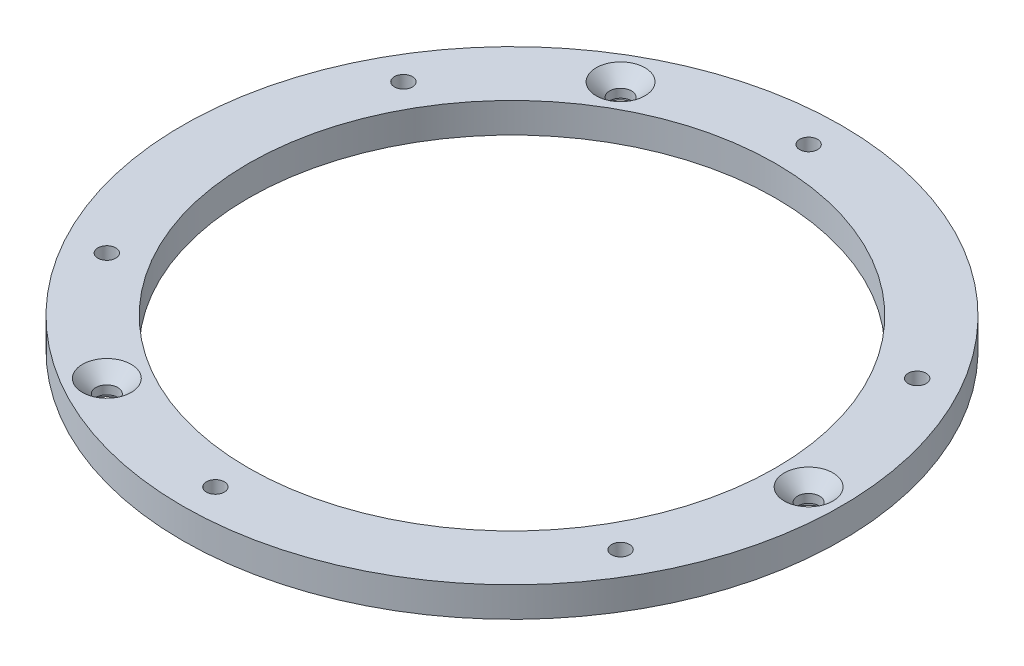
ISO-10303-21;
HEADER;
FILE_DESCRIPTION(('STEP AP214'),'2;1');
FILE_NAME('part.step','',(''),(''),'','','');
FILE_SCHEMA(('AUTOMOTIVE_DESIGN { 1 0 10303 214 1 1 1 1 }'));
ENDSEC;
DATA;
#1=APPLICATION_CONTEXT('core data for automotive mechanical design processes');
#2=APPLICATION_PROTOCOL_DEFINITION('international standard','automotive_design',2000,#1);
#3=PRODUCT_CONTEXT('',#1,'mechanical');
#4=PRODUCT('Part','Part','',(#3));
#5=PRODUCT_RELATED_PRODUCT_CATEGORY('part','',(#4));
#6=PRODUCT_DEFINITION_FORMATION('','',#4);
#7=PRODUCT_DEFINITION_CONTEXT('part definition',#1,'design');
#8=PRODUCT_DEFINITION('design','',#6,#7);
#9=PRODUCT_DEFINITION_SHAPE('','',#8);
#10=(LENGTH_UNIT() NAMED_UNIT(*) SI_UNIT(.MILLI.,.METRE.));
#11=(NAMED_UNIT(*) PLANE_ANGLE_UNIT() SI_UNIT($,.RADIAN.));
#12=(NAMED_UNIT(*) SI_UNIT($,.STERADIAN.) SOLID_ANGLE_UNIT());
#13=UNCERTAINTY_MEASURE_WITH_UNIT(LENGTH_MEASURE(1.E-05),#10,'distance_accuracy_value','');
#14=(GEOMETRIC_REPRESENTATION_CONTEXT(3) GLOBAL_UNCERTAINTY_ASSIGNED_CONTEXT((#13)) GLOBAL_UNIT_ASSIGNED_CONTEXT((#10,
#11,#12)) REPRESENTATION_CONTEXT('',''));
#15=CARTESIAN_POINT('',(0.,0.,0.));
#16=DIRECTION('',(0.,0.,1.));
#17=DIRECTION('',(1.,0.,0.));
#18=AXIS2_PLACEMENT_3D('',#15,#16,#17);
#19=CARTESIAN_POINT('',(0.,15.,0.));
#20=DIRECTION('',(0.,1.,0.));
#21=DIRECTION('',(0.,0.,1.));
#22=AXIS2_PLACEMENT_3D('',#19,#20,#21);
#23=PLANE('',#22);
#24=CARTESIAN_POINT('',(-74.2500000000016,15.,-128.604772461988));
#25=DIRECTION('',(0.,1.,0.));
#26=DIRECTION('',(0.,0.,1.));
#27=AXIS2_PLACEMENT_3D('',#24,#25,#26);
#28=CIRCLE('',#27,12.2);
#29=CARTESIAN_POINT('',(-74.2500000000016,15.,-116.404772461988));
#30=VERTEX_POINT('',#29);
#31=EDGE_CURVE('E162',#30,#30,#28,.T.);
#32=ORIENTED_EDGE('',*,*,#31,.F.);
#33=EDGE_LOOP('',(#32));
#34=FACE_BOUND('',#33,.T.);
#35=CARTESIAN_POINT('',(148.5,15.,-1.11022302462516E-12));
#36=DIRECTION('',(0.,1.,0.));
#37=DIRECTION('',(0.,0.,1.));
#38=AXIS2_PLACEMENT_3D('',#35,#36,#37);
#39=CIRCLE('',#38,12.2);
#40=CARTESIAN_POINT('',(148.5,15.,12.1999999999989));
#41=VERTEX_POINT('',#40);
#42=EDGE_CURVE('E71',#41,#41,#39,.T.);
#43=ORIENTED_EDGE('',*,*,#42,.F.);
#44=EDGE_LOOP('',(#43));
#45=FACE_BOUND('',#44,.T.);
#46=CARTESIAN_POINT('',(-74.2499999999998,15.,128.60477246199));
#47=DIRECTION('',(0.,1.,0.));
#48=DIRECTION('',(0.,0.,1.));
#49=AXIS2_PLACEMENT_3D('',#46,#47,#48);
#50=CIRCLE('',#49,12.2);
#51=CARTESIAN_POINT('',(-74.2499999999998,15.,140.80477246199));
#52=VERTEX_POINT('',#51);
#53=EDGE_CURVE('E82',#52,#52,#50,.T.);
#54=ORIENTED_EDGE('',*,*,#53,.F.);
#55=EDGE_LOOP('',(#54));
#56=FACE_BOUND('',#55,.T.);
#57=CARTESIAN_POINT('',(128.604772461988,15.,-74.2500000000016));
#58=DIRECTION('',(0.,-1.,0.));
#59=DIRECTION('',(0.,0.,-1.));
#60=AXIS2_PLACEMENT_3D('',#57,#58,#59);
#61=CIRCLE('',#60,4.5);
#62=CARTESIAN_POINT('',(128.604772461988,15.,-78.7500000000016));
#63=VERTEX_POINT('',#62);
#64=EDGE_CURVE('E100',#63,#63,#61,.T.);
#65=ORIENTED_EDGE('',*,*,#64,.T.);
#66=EDGE_LOOP('',(#65));
#67=FACE_BOUND('',#66,.T.);
#68=CARTESIAN_POINT('',(128.60477246199,15.,74.2499999999989));
#69=DIRECTION('',(0.,-1.,0.));
#70=DIRECTION('',(0.,0.,-1.));
#71=AXIS2_PLACEMENT_3D('',#68,#69,#70);
#72=CIRCLE('',#71,4.5);
#73=CARTESIAN_POINT('',(128.60477246199,15.,69.7499999999989));
#74=VERTEX_POINT('',#73);
#75=EDGE_CURVE('E106',#74,#74,#72,.T.);
#76=ORIENTED_EDGE('',*,*,#75,.T.);
#77=EDGE_LOOP('',(#76));
#78=FACE_BOUND('',#77,.T.);
#79=CARTESIAN_POINT('',(0.,15.,148.5));
#80=DIRECTION('',(0.,-1.,0.));
#81=DIRECTION('',(0.,0.,-1.));
#82=AXIS2_PLACEMENT_3D('',#79,#80,#81);
#83=CIRCLE('',#82,4.5);
#84=CARTESIAN_POINT('',(0.,15.,144.));
#85=VERTEX_POINT('',#84);
#86=EDGE_CURVE('E112',#85,#85,#83,.T.);
#87=ORIENTED_EDGE('',*,*,#86,.T.);
#88=EDGE_LOOP('',(#87));
#89=FACE_BOUND('',#88,.T.);
#90=CARTESIAN_POINT('',(-128.604772461989,15.,74.2500000000007));
#91=DIRECTION('',(0.,-1.,0.));
#92=DIRECTION('',(0.,0.,-1.));
#93=AXIS2_PLACEMENT_3D('',#90,#91,#92);
#94=CIRCLE('',#93,4.5);
#95=CARTESIAN_POINT('',(-128.604772461989,15.,69.7500000000007));
#96=VERTEX_POINT('',#95);
#97=EDGE_CURVE('E118',#96,#96,#94,.T.);
#98=ORIENTED_EDGE('',*,*,#97,.T.);
#99=EDGE_LOOP('',(#98));
#100=FACE_BOUND('',#99,.T.);
#101=CARTESIAN_POINT('',(-128.60477246199,15.,-74.2499999999998));
#102=DIRECTION('',(0.,-1.,0.));
#103=DIRECTION('',(0.,0.,-1.));
#104=AXIS2_PLACEMENT_3D('',#101,#102,#103);
#105=CIRCLE('',#104,4.5);
#106=CARTESIAN_POINT('',(-128.60477246199,15.,-78.7499999999998));
#107=VERTEX_POINT('',#106);
#108=EDGE_CURVE('E124',#107,#107,#105,.T.);
#109=ORIENTED_EDGE('',*,*,#108,.T.);
#110=EDGE_LOOP('',(#109));
#111=FACE_BOUND('',#110,.T.);
#112=CARTESIAN_POINT('',(0.,15.,-148.5));
#113=DIRECTION('',(0.,-1.,0.));
#114=DIRECTION('',(0.,0.,-1.));
#115=AXIS2_PLACEMENT_3D('',#112,#113,#114);
#116=CIRCLE('',#115,4.5);
#117=CARTESIAN_POINT('',(0.,15.,-153.));
#118=VERTEX_POINT('',#117);
#119=EDGE_CURVE('E130',#118,#118,#116,.T.);
#120=ORIENTED_EDGE('',*,*,#119,.T.);
#121=EDGE_LOOP('',(#120));
#122=FACE_BOUND('',#121,.T.);
#123=CARTESIAN_POINT('',(0.,15.,0.));
#124=DIRECTION('',(0.,1.,0.));
#125=DIRECTION('',(0.,0.,1.));
#126=AXIS2_PLACEMENT_3D('',#123,#124,#125);
#127=CIRCLE('',#126,165.);
#128=CARTESIAN_POINT('',(0.,15.,165.));
#129=VERTEX_POINT('',#128);
#130=EDGE_CURVE('E10',#129,#129,#127,.T.);
#131=ORIENTED_EDGE('',*,*,#130,.T.);
#132=EDGE_LOOP('',(#131));
#133=FACE_BOUND('',#132,.T.);
#134=CARTESIAN_POINT('',(0.,15.,0.));
#135=DIRECTION('',(0.,1.,0.));
#136=DIRECTION('',(0.,0.,1.));
#137=AXIS2_PLACEMENT_3D('',#134,#135,#136);
#138=CIRCLE('',#137,132.);
#139=CARTESIAN_POINT('',(0.,15.,132.));
#140=VERTEX_POINT('',#139);
#141=EDGE_CURVE('E51',#140,#140,#138,.T.);
#142=ORIENTED_EDGE('',*,*,#141,.F.);
#143=EDGE_LOOP('',(#142));
#144=FACE_BOUND('',#143,.T.);
#145=ADVANCED_FACE('F38',(#34,#45,#56,#67,#78,#89,#100,#111,#122,#133,#144),#23,.T.);
#146=CARTESIAN_POINT('',(0.,0.,0.));
#147=DIRECTION('',(0.,1.,0.));
#148=DIRECTION('',(0.,0.,1.));
#149=AXIS2_PLACEMENT_3D('',#146,#147,#148);
#150=PLANE('',#149);
#151=CARTESIAN_POINT('',(148.5,0.,-1.11022302462516E-12));
#152=DIRECTION('',(0.,-1.,0.));
#153=DIRECTION('',(-0.866025403784438,0.,0.500000000000005));
#154=AXIS2_PLACEMENT_3D('',#151,#152,#153);
#155=CIRCLE('',#154,9.99999999999998);
#156=CARTESIAN_POINT('',(139.839745962156,0.,4.99999999999893));
#157=VERTEX_POINT('',#156);
#158=EDGE_CURVE('E83',#157,#157,#155,.T.);
#159=ORIENTED_EDGE('',*,*,#158,.F.);
#160=EDGE_LOOP('',(#159));
#161=FACE_BOUND('',#160,.T.);
#162=CARTESIAN_POINT('',(-74.2500000000016,0.,-128.604772461988));
#163=DIRECTION('',(0.,-1.,0.));
#164=DIRECTION('',(0.866025403784445,0.,0.499999999999993));
#165=AXIS2_PLACEMENT_3D('',#162,#163,#164);
#166=CIRCLE('',#165,9.99999999999998);
#167=CARTESIAN_POINT('',(-65.5897459621572,0.,-123.604772461988));
#168=VERTEX_POINT('',#167);
#169=EDGE_CURVE('E63',#168,#168,#166,.T.);
#170=ORIENTED_EDGE('',*,*,#169,.F.);
#171=EDGE_LOOP('',(#170));
#172=FACE_BOUND('',#171,.T.);
#173=CARTESIAN_POINT('',(-74.2499999999998,0.,128.60477246199));
#174=DIRECTION('',(0.,-1.,0.));
#175=DIRECTION('',(0.,0.,-1.));
#176=AXIS2_PLACEMENT_3D('',#173,#174,#175);
#177=CIRCLE('',#176,9.99999999999998);
#178=CARTESIAN_POINT('',(-74.2499999999998,0.,118.60477246199));
#179=VERTEX_POINT('',#178);
#180=EDGE_CURVE('E59',#179,#179,#177,.T.);
#181=ORIENTED_EDGE('',*,*,#180,.F.);
#182=EDGE_LOOP('',(#181));
#183=FACE_BOUND('',#182,.T.);
#184=CARTESIAN_POINT('',(128.604772461988,0.,-74.2500000000016));
#185=DIRECTION('',(0.,-1.,0.));
#186=DIRECTION('',(0.,0.,-1.));
#187=AXIS2_PLACEMENT_3D('',#184,#185,#186);
#188=CIRCLE('',#187,4.5);
#189=CARTESIAN_POINT('',(128.604772461988,0.,-78.7500000000016));
#190=VERTEX_POINT('',#189);
#191=EDGE_CURVE('E95',#190,#190,#188,.T.);
#192=ORIENTED_EDGE('',*,*,#191,.F.);
#193=EDGE_LOOP('',(#192));
#194=FACE_BOUND('',#193,.T.);
#195=CARTESIAN_POINT('',(128.60477246199,0.,74.2499999999989));
#196=DIRECTION('',(0.,-1.,0.));
#197=DIRECTION('',(0.,0.,-1.));
#198=AXIS2_PLACEMENT_3D('',#195,#196,#197);
#199=CIRCLE('',#198,4.5);
#200=CARTESIAN_POINT('',(128.60477246199,0.,69.7499999999989));
#201=VERTEX_POINT('',#200);
#202=EDGE_CURVE('E103',#201,#201,#199,.T.);
#203=ORIENTED_EDGE('',*,*,#202,.F.);
#204=EDGE_LOOP('',(#203));
#205=FACE_BOUND('',#204,.T.);
#206=CARTESIAN_POINT('',(0.,0.,148.5));
#207=DIRECTION('',(0.,-1.,0.));
#208=DIRECTION('',(0.,0.,-1.));
#209=AXIS2_PLACEMENT_3D('',#206,#207,#208);
#210=CIRCLE('',#209,4.5);
#211=CARTESIAN_POINT('',(0.,0.,144.));
#212=VERTEX_POINT('',#211);
#213=EDGE_CURVE('E109',#212,#212,#210,.T.);
#214=ORIENTED_EDGE('',*,*,#213,.F.);
#215=EDGE_LOOP('',(#214));
#216=FACE_BOUND('',#215,.T.);
#217=CARTESIAN_POINT('',(-128.604772461989,0.,74.2500000000007));
#218=DIRECTION('',(0.,-1.,0.));
#219=DIRECTION('',(0.,0.,-1.));
#220=AXIS2_PLACEMENT_3D('',#217,#218,#219);
#221=CIRCLE('',#220,4.5);
#222=CARTESIAN_POINT('',(-128.604772461989,0.,69.7500000000007));
#223=VERTEX_POINT('',#222);
#224=EDGE_CURVE('E115',#223,#223,#221,.T.);
#225=ORIENTED_EDGE('',*,*,#224,.F.);
#226=EDGE_LOOP('',(#225));
#227=FACE_BOUND('',#226,.T.);
#228=CARTESIAN_POINT('',(-128.60477246199,0.,-74.2499999999998));
#229=DIRECTION('',(0.,-1.,0.));
#230=DIRECTION('',(0.,0.,-1.));
#231=AXIS2_PLACEMENT_3D('',#228,#229,#230);
#232=CIRCLE('',#231,4.5);
#233=CARTESIAN_POINT('',(-128.60477246199,0.,-78.7499999999998));
#234=VERTEX_POINT('',#233);
#235=EDGE_CURVE('E121',#234,#234,#232,.T.);
#236=ORIENTED_EDGE('',*,*,#235,.F.);
#237=EDGE_LOOP('',(#236));
#238=FACE_BOUND('',#237,.T.);
#239=CARTESIAN_POINT('',(0.,0.,-148.5));
#240=DIRECTION('',(0.,-1.,0.));
#241=DIRECTION('',(0.,0.,-1.));
#242=AXIS2_PLACEMENT_3D('',#239,#240,#241);
#243=CIRCLE('',#242,4.5);
#244=CARTESIAN_POINT('',(0.,0.,-153.));
#245=VERTEX_POINT('',#244);
#246=EDGE_CURVE('E127',#245,#245,#243,.T.);
#247=ORIENTED_EDGE('',*,*,#246,.F.);
#248=EDGE_LOOP('',(#247));
#249=FACE_BOUND('',#248,.T.);
#250=CARTESIAN_POINT('',(0.,0.,0.));
#251=DIRECTION('',(0.,1.,0.));
#252=DIRECTION('',(0.,0.,1.));
#253=AXIS2_PLACEMENT_3D('',#250,#251,#252);
#254=CIRCLE('',#253,165.);
#255=CARTESIAN_POINT('',(0.,0.,165.));
#256=VERTEX_POINT('',#255);
#257=EDGE_CURVE('E46',#256,#256,#254,.T.);
#258=ORIENTED_EDGE('',*,*,#257,.F.);
#259=EDGE_LOOP('',(#258));
#260=FACE_BOUND('',#259,.T.);
#261=CARTESIAN_POINT('',(0.,0.,0.));
#262=DIRECTION('',(0.,1.,0.));
#263=DIRECTION('',(0.,0.,1.));
#264=AXIS2_PLACEMENT_3D('',#261,#262,#263);
#265=CIRCLE('',#264,132.);
#266=CARTESIAN_POINT('',(0.,0.,132.));
#267=VERTEX_POINT('',#266);
#268=EDGE_CURVE('E54',#267,#267,#265,.T.);
#269=ORIENTED_EDGE('',*,*,#268,.T.);
#270=EDGE_LOOP('',(#269));
#271=FACE_BOUND('',#270,.T.);
#272=ADVANCED_FACE('F138',(#161,#172,#183,#194,#205,#216,#227,#238,#249,#260,#271),#150,.F.);
#273=CARTESIAN_POINT('',(0.,15.,0.));
#274=DIRECTION('',(0.,-1.,0.));
#275=DIRECTION('',(0.,0.,-1.));
#276=AXIS2_PLACEMENT_3D('',#273,#274,#275);
#277=CYLINDRICAL_SURFACE('',#276,165.);
#278=ORIENTED_EDGE('',*,*,#130,.F.);
#279=EDGE_LOOP('',(#278));
#280=FACE_BOUND('',#279,.T.);
#281=ORIENTED_EDGE('',*,*,#257,.T.);
#282=EDGE_LOOP('',(#281));
#283=FACE_BOUND('',#282,.T.);
#284=ADVANCED_FACE('F40',(#280,#283),#277,.T.);
#285=CARTESIAN_POINT('',(0.,15.,0.));
#286=DIRECTION('',(0.,-1.,0.));
#287=DIRECTION('',(0.,0.,-1.));
#288=AXIS2_PLACEMENT_3D('',#285,#286,#287);
#289=CYLINDRICAL_SURFACE('',#288,132.);
#290=ORIENTED_EDGE('',*,*,#141,.T.);
#291=EDGE_LOOP('',(#290));
#292=FACE_BOUND('',#291,.T.);
#293=ORIENTED_EDGE('',*,*,#268,.F.);
#294=EDGE_LOOP('',(#293));
#295=FACE_BOUND('',#294,.T.);
#296=ADVANCED_FACE('F140',(#292,#295),#289,.F.);
#297=CARTESIAN_POINT('',(0.,0.,-148.5));
#298=DIRECTION('',(0.,-1.,0.));
#299=DIRECTION('',(0.,0.,-1.));
#300=AXIS2_PLACEMENT_3D('',#297,#298,#299);
#301=CYLINDRICAL_SURFACE('',#300,4.5);
#302=ORIENTED_EDGE('',*,*,#119,.F.);
#303=EDGE_LOOP('',(#302));
#304=FACE_BOUND('',#303,.T.);
#305=ORIENTED_EDGE('',*,*,#246,.T.);
#306=EDGE_LOOP('',(#305));
#307=FACE_BOUND('',#306,.T.);
#308=ADVANCED_FACE('F142',(#304,#307),#301,.F.);
#309=CARTESIAN_POINT('',(-128.60477246199,0.,-74.2499999999998));
#310=DIRECTION('',(0.,-1.,0.));
#311=DIRECTION('',(0.,0.,-1.));
#312=AXIS2_PLACEMENT_3D('',#309,#310,#311);
#313=CYLINDRICAL_SURFACE('',#312,4.5);
#314=ORIENTED_EDGE('',*,*,#108,.F.);
#315=EDGE_LOOP('',(#314));
#316=FACE_BOUND('',#315,.T.);
#317=ORIENTED_EDGE('',*,*,#235,.T.);
#318=EDGE_LOOP('',(#317));
#319=FACE_BOUND('',#318,.T.);
#320=ADVANCED_FACE('F148',(#316,#319),#313,.F.);
#321=CARTESIAN_POINT('',(-128.604772461989,0.,74.2500000000007));
#322=DIRECTION('',(0.,-1.,0.));
#323=DIRECTION('',(0.,0.,-1.));
#324=AXIS2_PLACEMENT_3D('',#321,#322,#323);
#325=CYLINDRICAL_SURFACE('',#324,4.5);
#326=ORIENTED_EDGE('',*,*,#97,.F.);
#327=EDGE_LOOP('',(#326));
#328=FACE_BOUND('',#327,.T.);
#329=ORIENTED_EDGE('',*,*,#224,.T.);
#330=EDGE_LOOP('',(#329));
#331=FACE_BOUND('',#330,.T.);
#332=ADVANCED_FACE('F188',(#328,#331),#325,.F.);
#333=CARTESIAN_POINT('',(0.,0.,148.5));
#334=DIRECTION('',(0.,-1.,0.));
#335=DIRECTION('',(0.,0.,-1.));
#336=AXIS2_PLACEMENT_3D('',#333,#334,#335);
#337=CYLINDRICAL_SURFACE('',#336,4.5);
#338=ORIENTED_EDGE('',*,*,#86,.F.);
#339=EDGE_LOOP('',(#338));
#340=FACE_BOUND('',#339,.T.);
#341=ORIENTED_EDGE('',*,*,#213,.T.);
#342=EDGE_LOOP('',(#341));
#343=FACE_BOUND('',#342,.T.);
#344=ADVANCED_FACE('F195',(#340,#343),#337,.F.);
#345=CARTESIAN_POINT('',(128.60477246199,0.,74.2499999999989));
#346=DIRECTION('',(0.,-1.,0.));
#347=DIRECTION('',(0.,0.,-1.));
#348=AXIS2_PLACEMENT_3D('',#345,#346,#347);
#349=CYLINDRICAL_SURFACE('',#348,4.5);
#350=ORIENTED_EDGE('',*,*,#75,.F.);
#351=EDGE_LOOP('',(#350));
#352=FACE_BOUND('',#351,.T.);
#353=ORIENTED_EDGE('',*,*,#202,.T.);
#354=EDGE_LOOP('',(#353));
#355=FACE_BOUND('',#354,.T.);
#356=ADVANCED_FACE('F201',(#352,#355),#349,.F.);
#357=CARTESIAN_POINT('',(128.604772461988,0.,-74.2500000000016));
#358=DIRECTION('',(0.,-1.,0.));
#359=DIRECTION('',(0.,0.,-1.));
#360=AXIS2_PLACEMENT_3D('',#357,#358,#359);
#361=CYLINDRICAL_SURFACE('',#360,4.5);
#362=ORIENTED_EDGE('',*,*,#64,.F.);
#363=EDGE_LOOP('',(#362));
#364=FACE_BOUND('',#363,.T.);
#365=ORIENTED_EDGE('',*,*,#191,.T.);
#366=EDGE_LOOP('',(#365));
#367=FACE_BOUND('',#366,.T.);
#368=ADVANCED_FACE('F205',(#364,#367),#361,.F.);
#369=CARTESIAN_POINT('',(-74.2499999999998,4.,128.60477246199));
#370=DIRECTION('',(0.,-1.,0.));
#371=DIRECTION('',(0.,0.,-1.));
#372=AXIS2_PLACEMENT_3D('',#369,#370,#371);
#373=CYLINDRICAL_SURFACE('',#372,9.99999999999998);
#374=CARTESIAN_POINT('',(-74.2499999999998,4.,128.60477246199));
#375=DIRECTION('',(0.,-1.,0.));
#376=DIRECTION('',(0.,0.,-1.));
#377=AXIS2_PLACEMENT_3D('',#374,#375,#376);
#378=CIRCLE('',#377,9.99999999999998);
#379=CARTESIAN_POINT('',(-74.2499999999998,4.,118.60477246199));
#380=VERTEX_POINT('',#379);
#381=EDGE_CURVE('E92',#380,#380,#378,.T.);
#382=ORIENTED_EDGE('',*,*,#381,.F.);
#383=EDGE_LOOP('',(#382));
#384=FACE_BOUND('',#383,.T.);
#385=ORIENTED_EDGE('',*,*,#180,.T.);
#386=EDGE_LOOP('',(#385));
#387=FACE_BOUND('',#386,.T.);
#388=ADVANCED_FACE('F209',(#384,#387),#373,.F.);
#389=CARTESIAN_POINT('',(-74.2499999999998,4.,128.60477246199));
#390=DIRECTION('',(0.,-1.,0.));
#391=DIRECTION('',(0.,0.,-1.));
#392=AXIS2_PLACEMENT_3D('',#389,#390,#391);
#393=PLANE('',#392);
#394=CARTESIAN_POINT('',(-74.2499999999998,4.,128.60477246199));
#395=DIRECTION('',(0.,-1.,0.));
#396=DIRECTION('',(0.,0.,-1.));
#397=AXIS2_PLACEMENT_3D('',#394,#395,#396);
#398=CIRCLE('',#397,5.49999999999999);
#399=CARTESIAN_POINT('',(-74.2499999999998,4.,123.10477246199));
#400=VERTEX_POINT('',#399);
#401=EDGE_CURVE('E57',#400,#400,#398,.T.);
#402=ORIENTED_EDGE('',*,*,#401,.F.);
#403=EDGE_LOOP('',(#402));
#404=FACE_BOUND('',#403,.T.);
#405=ORIENTED_EDGE('',*,*,#381,.T.);
#406=EDGE_LOOP('',(#405));
#407=FACE_BOUND('',#406,.T.);
#408=ADVANCED_FACE('F213',(#404,#407),#393,.T.);
#409=CARTESIAN_POINT('',(-74.2499999999998,15.,128.60477246199));
#410=DIRECTION('',(0.,1.,0.));
#411=DIRECTION('',(0.,0.,1.));
#412=AXIS2_PLACEMENT_3D('',#409,#410,#411);
#413=CYLINDRICAL_SURFACE('',#412,5.49999999999999);
#414=ORIENTED_EDGE('',*,*,#401,.T.);
#415=EDGE_LOOP('',(#414));
#416=FACE_BOUND('',#415,.T.);
#417=CARTESIAN_POINT('',(-74.2499999999998,8.30000000000003,128.60477246199));
#418=DIRECTION('',(0.,1.,0.));
#419=DIRECTION('',(0.,0.,1.));
#420=AXIS2_PLACEMENT_3D('',#417,#418,#419);
#421=CIRCLE('',#420,5.49999999999999);
#422=CARTESIAN_POINT('',(-74.2499999999998,8.30000000000003,134.10477246199));
#423=VERTEX_POINT('',#422);
#424=EDGE_CURVE('E60',#423,#423,#421,.T.);
#425=ORIENTED_EDGE('',*,*,#424,.T.);
#426=EDGE_LOOP('',(#425));
#427=FACE_BOUND('',#426,.T.);
#428=ADVANCED_FACE('F217',(#416,#427),#413,.F.);
#429=CARTESIAN_POINT('',(-74.2499999999998,15.,128.60477246199));
#430=DIRECTION('',(0.,1.,0.));
#431=DIRECTION('',(0.,0.,1.));
#432=AXIS2_PLACEMENT_3D('',#429,#430,#431);
#433=CONICAL_SURFACE('',#432,12.2,0.78539816339745);
#434=ORIENTED_EDGE('',*,*,#424,.F.);
#435=EDGE_LOOP('',(#434));
#436=FACE_BOUND('',#435,.T.);
#437=ORIENTED_EDGE('',*,*,#53,.T.);
#438=EDGE_LOOP('',(#437));
#439=FACE_BOUND('',#438,.T.);
#440=ADVANCED_FACE('F221',(#436,#439),#433,.F.);
#441=CARTESIAN_POINT('',(-74.2500000000016,4.,-128.604772461988));
#442=DIRECTION('',(0.,-1.,0.));
#443=DIRECTION('',(0.,0.,-1.));
#444=AXIS2_PLACEMENT_3D('',#441,#442,#443);
#445=CYLINDRICAL_SURFACE('',#444,9.99999999999998);
#446=CARTESIAN_POINT('',(-74.2500000000016,4.,-128.604772461988));
#447=DIRECTION('',(0.,-1.,0.));
#448=DIRECTION('',(0.866025403784445,0.,0.499999999999993));
#449=AXIS2_PLACEMENT_3D('',#446,#447,#448);
#450=CIRCLE('',#449,9.99999999999998);
#451=CARTESIAN_POINT('',(-65.5897459621572,4.,-123.604772461988));
#452=VERTEX_POINT('',#451);
#453=EDGE_CURVE('E68',#452,#452,#450,.T.);
#454=ORIENTED_EDGE('',*,*,#453,.F.);
#455=EDGE_LOOP('',(#454));
#456=FACE_BOUND('',#455,.T.);
#457=ORIENTED_EDGE('',*,*,#169,.T.);
#458=EDGE_LOOP('',(#457));
#459=FACE_BOUND('',#458,.T.);
#460=ADVANCED_FACE('F225',(#456,#459),#445,.F.);
#461=CARTESIAN_POINT('',(-74.2500000000016,4.,-128.604772461988));
#462=DIRECTION('',(0.,-1.,0.));
#463=DIRECTION('',(0.866025403784445,0.,0.499999999999993));
#464=AXIS2_PLACEMENT_3D('',#461,#462,#463);
#465=PLANE('',#464);
#466=CARTESIAN_POINT('',(-74.2500000000016,4.,-128.604772461988));
#467=DIRECTION('',(0.,-1.,0.));
#468=DIRECTION('',(0.,0.,-1.));
#469=AXIS2_PLACEMENT_3D('',#466,#467,#468);
#470=CIRCLE('',#469,5.49999999999999);
#471=CARTESIAN_POINT('',(-74.2500000000016,4.,-134.104772461988));
#472=VERTEX_POINT('',#471);
#473=EDGE_CURVE('E42',#472,#472,#470,.T.);
#474=ORIENTED_EDGE('',*,*,#473,.F.);
#475=EDGE_LOOP('',(#474));
#476=FACE_BOUND('',#475,.T.);
#477=ORIENTED_EDGE('',*,*,#453,.T.);
#478=EDGE_LOOP('',(#477));
#479=FACE_BOUND('',#478,.T.);
#480=ADVANCED_FACE('F229',(#476,#479),#465,.T.);
#481=CARTESIAN_POINT('',(148.5,4.,-1.11022302462516E-12));
#482=DIRECTION('',(0.,-1.,0.));
#483=DIRECTION('',(0.,0.,-1.));
#484=AXIS2_PLACEMENT_3D('',#481,#482,#483);
#485=CYLINDRICAL_SURFACE('',#484,9.99999999999998);
#486=CARTESIAN_POINT('',(148.5,4.,-1.11022302462516E-12));
#487=DIRECTION('',(0.,-1.,0.));
#488=DIRECTION('',(-0.866025403784438,0.,0.500000000000005));
#489=AXIS2_PLACEMENT_3D('',#486,#487,#488);
#490=CIRCLE('',#489,9.99999999999998);
#491=CARTESIAN_POINT('',(139.839745962156,4.,4.99999999999893));
#492=VERTEX_POINT('',#491);
#493=EDGE_CURVE('E79',#492,#492,#490,.T.);
#494=ORIENTED_EDGE('',*,*,#493,.F.);
#495=EDGE_LOOP('',(#494));
#496=FACE_BOUND('',#495,.T.);
#497=ORIENTED_EDGE('',*,*,#158,.T.);
#498=EDGE_LOOP('',(#497));
#499=FACE_BOUND('',#498,.T.);
#500=ADVANCED_FACE('F233',(#496,#499),#485,.F.);
#501=CARTESIAN_POINT('',(148.5,4.,-1.11022302462516E-12));
#502=DIRECTION('',(0.,-1.,0.));
#503=DIRECTION('',(-0.866025403784438,0.,0.500000000000005));
#504=AXIS2_PLACEMENT_3D('',#501,#502,#503);
#505=PLANE('',#504);
#506=CARTESIAN_POINT('',(148.5,4.,-1.11022302462516E-12));
#507=DIRECTION('',(0.,-1.,0.));
#508=DIRECTION('',(0.,0.,-1.));
#509=AXIS2_PLACEMENT_3D('',#506,#507,#508);
#510=CIRCLE('',#509,5.50000000000001);
#511=CARTESIAN_POINT('',(148.5,4.,-5.50000000000112));
#512=VERTEX_POINT('',#511);
#513=EDGE_CURVE('E61',#512,#512,#510,.T.);
#514=ORIENTED_EDGE('',*,*,#513,.F.);
#515=EDGE_LOOP('',(#514));
#516=FACE_BOUND('',#515,.T.);
#517=ORIENTED_EDGE('',*,*,#493,.T.);
#518=EDGE_LOOP('',(#517));
#519=FACE_BOUND('',#518,.T.);
#520=ADVANCED_FACE('F237',(#516,#519),#505,.T.);
#521=CARTESIAN_POINT('',(148.5,15.,-1.11022302462516E-12));
#522=DIRECTION('',(0.,1.,0.));
#523=DIRECTION('',(0.,0.,1.));
#524=AXIS2_PLACEMENT_3D('',#521,#522,#523);
#525=CYLINDRICAL_SURFACE('',#524,5.50000000000001);
#526=ORIENTED_EDGE('',*,*,#513,.T.);
#527=EDGE_LOOP('',(#526));
#528=FACE_BOUND('',#527,.T.);
#529=CARTESIAN_POINT('',(148.5,8.30000000000003,-1.11022302462516E-12));
#530=DIRECTION('',(0.,1.,0.));
#531=DIRECTION('',(0.,0.,1.));
#532=AXIS2_PLACEMENT_3D('',#529,#530,#531);
#533=CIRCLE('',#532,5.50000000000001);
#534=CARTESIAN_POINT('',(148.5,8.30000000000003,5.4999999999989));
#535=VERTEX_POINT('',#534);
#536=EDGE_CURVE('E64',#535,#535,#533,.T.);
#537=ORIENTED_EDGE('',*,*,#536,.T.);
#538=EDGE_LOOP('',(#537));
#539=FACE_BOUND('',#538,.T.);
#540=ADVANCED_FACE('F241',(#528,#539),#525,.F.);
#541=CARTESIAN_POINT('',(148.5,15.,-1.11022302462516E-12));
#542=DIRECTION('',(0.,1.,0.));
#543=DIRECTION('',(0.,0.,1.));
#544=AXIS2_PLACEMENT_3D('',#541,#542,#543);
#545=CONICAL_SURFACE('',#544,12.2,0.785398163397447);
#546=ORIENTED_EDGE('',*,*,#536,.F.);
#547=EDGE_LOOP('',(#546));
#548=FACE_BOUND('',#547,.T.);
#549=ORIENTED_EDGE('',*,*,#42,.T.);
#550=EDGE_LOOP('',(#549));
#551=FACE_BOUND('',#550,.T.);
#552=ADVANCED_FACE('F245',(#548,#551),#545,.F.);
#553=CARTESIAN_POINT('',(-74.2500000000016,15.,-128.604772461988));
#554=DIRECTION('',(0.,1.,0.));
#555=DIRECTION('',(0.,0.,1.));
#556=AXIS2_PLACEMENT_3D('',#553,#554,#555);
#557=CYLINDRICAL_SURFACE('',#556,5.49999999999999);
#558=ORIENTED_EDGE('',*,*,#473,.T.);
#559=EDGE_LOOP('',(#558));
#560=FACE_BOUND('',#559,.T.);
#561=CARTESIAN_POINT('',(-74.2500000000016,8.30000000000003,-128.604772461988));
#562=DIRECTION('',(0.,1.,0.));
#563=DIRECTION('',(0.,0.,1.));
#564=AXIS2_PLACEMENT_3D('',#561,#562,#563);
#565=CIRCLE('',#564,5.49999999999999);
#566=CARTESIAN_POINT('',(-74.2500000000016,8.30000000000003,-123.104772461988));
#567=VERTEX_POINT('',#566);
#568=EDGE_CURVE('E261',#567,#567,#565,.T.);
#569=ORIENTED_EDGE('',*,*,#568,.T.);
#570=EDGE_LOOP('',(#569));
#571=FACE_BOUND('',#570,.T.);
#572=ADVANCED_FACE('F248',(#560,#571),#557,.F.);
#573=CARTESIAN_POINT('',(-74.2500000000016,15.,-128.604772461988));
#574=DIRECTION('',(0.,1.,0.));
#575=DIRECTION('',(0.,0.,1.));
#576=AXIS2_PLACEMENT_3D('',#573,#574,#575);
#577=CONICAL_SURFACE('',#576,12.2,0.78539816339745);
#578=ORIENTED_EDGE('',*,*,#568,.F.);
#579=EDGE_LOOP('',(#578));
#580=FACE_BOUND('',#579,.T.);
#581=ORIENTED_EDGE('',*,*,#31,.T.);
#582=EDGE_LOOP('',(#581));
#583=FACE_BOUND('',#582,.T.);
#584=ADVANCED_FACE('F252',(#580,#583),#577,.F.);
#585=CLOSED_SHELL('',(#145,#272,#284,#296,#308,#320,#332,#344,#356,#368,#388,#408,#428,#440,
#460,#480,#500,#520,#540,#552,#572,#584));
#586=MANIFOLD_SOLID_BREP('B2',#585);
#587=ADVANCED_BREP_SHAPE_REPRESENTATION('',(#18,#586),#14);
#588=SHAPE_DEFINITION_REPRESENTATION(#9,#587);
ENDSEC;
END-ISO-10303-21;
